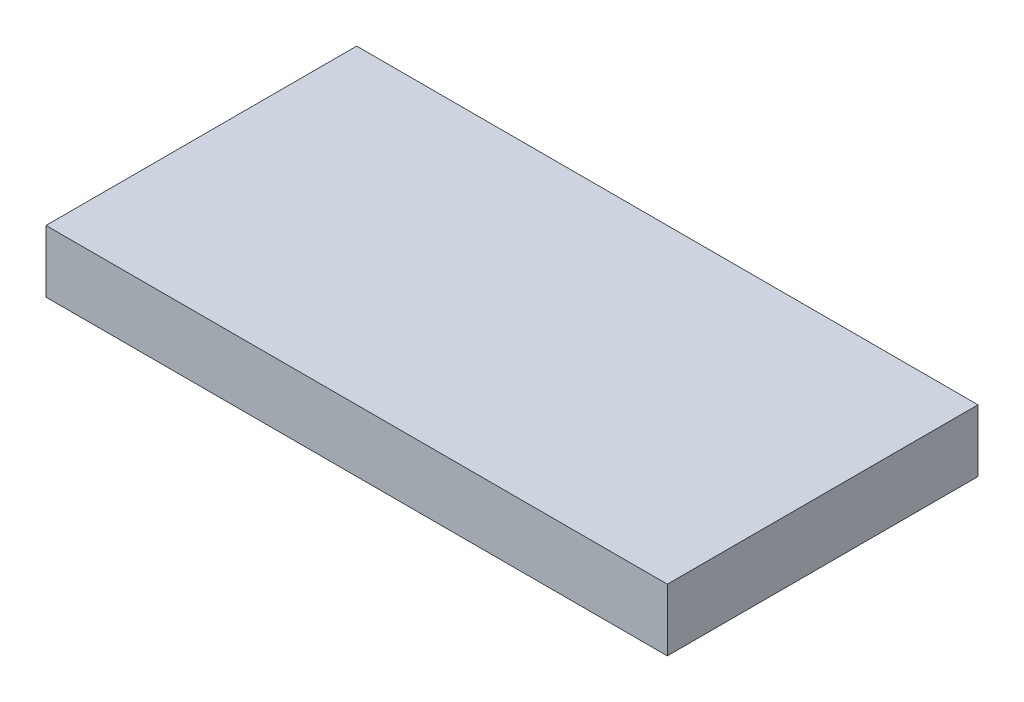
ISO-10303-21;
HEADER;
FILE_DESCRIPTION(('STEP AP214'),'2;1');
FILE_NAME('part.step','',(''),(''),'','','');
FILE_SCHEMA(('AUTOMOTIVE_DESIGN { 1 0 10303 214 1 1 1 1 }'));
ENDSEC;
DATA;
#1=APPLICATION_CONTEXT('core data for automotive mechanical design processes');
#2=APPLICATION_PROTOCOL_DEFINITION('international standard','automotive_design',2000,#1);
#3=PRODUCT_CONTEXT('',#1,'mechanical');
#4=PRODUCT('Part','Part','',(#3));
#5=PRODUCT_RELATED_PRODUCT_CATEGORY('part','',(#4));
#6=PRODUCT_DEFINITION_FORMATION('','',#4);
#7=PRODUCT_DEFINITION_CONTEXT('part definition',#1,'design');
#8=PRODUCT_DEFINITION('design','',#6,#7);
#9=PRODUCT_DEFINITION_SHAPE('','',#8);
#10=(LENGTH_UNIT() NAMED_UNIT(*) SI_UNIT(.MILLI.,.METRE.));
#11=(NAMED_UNIT(*) PLANE_ANGLE_UNIT() SI_UNIT($,.RADIAN.));
#12=(NAMED_UNIT(*) SI_UNIT($,.STERADIAN.) SOLID_ANGLE_UNIT());
#13=UNCERTAINTY_MEASURE_WITH_UNIT(LENGTH_MEASURE(1.E-05),#10,'distance_accuracy_value','');
#14=(GEOMETRIC_REPRESENTATION_CONTEXT(3) GLOBAL_UNCERTAINTY_ASSIGNED_CONTEXT((#13)) GLOBAL_UNIT_ASSIGNED_CONTEXT((#10,
#11,#12)) REPRESENTATION_CONTEXT('',''));
#15=CARTESIAN_POINT('',(0.,0.,0.));
#16=DIRECTION('',(0.,0.,1.));
#17=DIRECTION('',(1.,0.,0.));
#18=AXIS2_PLACEMENT_3D('',#15,#16,#17);
#19=CARTESIAN_POINT('',(0.,4.,0.));
#20=DIRECTION('',(1.,0.,0.));
#21=DIRECTION('',(0.,0.,-1.));
#22=AXIS2_PLACEMENT_3D('',#19,#20,#21);
#23=PLANE('',#22);
#24=DIRECTION('',(0.,0.,1.));
#25=VECTOR('',#24,1.);
#26=CARTESIAN_POINT('',(0.,0.,0.));
#27=LINE('',#26,#25);
#28=CARTESIAN_POINT('',(0.,0.,-20.));
#29=VERTEX_POINT('',#28);
#30=CARTESIAN_POINT('',(0.,0.,0.));
#31=VERTEX_POINT('',#30);
#32=EDGE_CURVE('E105',#29,#31,#27,.T.);
#33=ORIENTED_EDGE('',*,*,#32,.T.);
#34=DIRECTION('',(0.,-1.,0.));
#35=VECTOR('',#34,1.);
#36=CARTESIAN_POINT('',(0.,4.,0.));
#37=LINE('',#36,#35);
#38=CARTESIAN_POINT('',(0.,4.,0.));
#39=VERTEX_POINT('',#38);
#40=EDGE_CURVE('E11',#39,#31,#37,.T.);
#41=ORIENTED_EDGE('',*,*,#40,.F.);
#42=DIRECTION('',(0.,0.,1.));
#43=VECTOR('',#42,1.);
#44=CARTESIAN_POINT('',(0.,4.,0.));
#45=LINE('',#44,#43);
#46=CARTESIAN_POINT('',(0.,4.,-20.));
#47=VERTEX_POINT('',#46);
#48=EDGE_CURVE('E89',#47,#39,#45,.T.);
#49=ORIENTED_EDGE('',*,*,#48,.F.);
#50=DIRECTION('',(0.,-1.,0.));
#51=VECTOR('',#50,1.);
#52=CARTESIAN_POINT('',(0.,4.,-20.));
#53=LINE('',#52,#51);
#54=EDGE_CURVE('E97',#47,#29,#53,.T.);
#55=ORIENTED_EDGE('',*,*,#54,.T.);
#56=EDGE_LOOP('',(#33,#41,#49,#55));
#57=FACE_BOUND('',#56,.T.);
#58=ADVANCED_FACE('F39',(#57),#23,.F.);
#59=CARTESIAN_POINT('',(0.,4.,0.));
#60=DIRECTION('',(0.,0.,-1.));
#61=DIRECTION('',(-1.,0.,0.));
#62=AXIS2_PLACEMENT_3D('',#59,#60,#61);
#63=PLANE('',#62);
#64=DIRECTION('',(1.,0.,0.));
#65=VECTOR('',#64,1.);
#66=CARTESIAN_POINT('',(0.,0.,0.));
#67=LINE('',#66,#65);
#68=CARTESIAN_POINT('',(40.,0.,0.));
#69=VERTEX_POINT('',#68);
#70=EDGE_CURVE('E92',#31,#69,#67,.T.);
#71=ORIENTED_EDGE('',*,*,#70,.T.);
#72=DIRECTION('',(0.,-1.,0.));
#73=VECTOR('',#72,1.);
#74=CARTESIAN_POINT('',(40.,4.,0.));
#75=LINE('',#74,#73);
#76=CARTESIAN_POINT('',(40.,4.,0.));
#77=VERTEX_POINT('',#76);
#78=EDGE_CURVE('E50',#77,#69,#75,.T.);
#79=ORIENTED_EDGE('',*,*,#78,.F.);
#80=DIRECTION('',(1.,0.,0.));
#81=VECTOR('',#80,1.);
#82=CARTESIAN_POINT('',(0.,4.,0.));
#83=LINE('',#82,#81);
#84=EDGE_CURVE('E82',#39,#77,#83,.T.);
#85=ORIENTED_EDGE('',*,*,#84,.F.);
#86=ORIENTED_EDGE('',*,*,#40,.T.);
#87=EDGE_LOOP('',(#71,#79,#85,#86));
#88=FACE_BOUND('',#87,.T.);
#89=ADVANCED_FACE('F93',(#88),#63,.F.);
#90=CARTESIAN_POINT('',(40.,4.,0.));
#91=DIRECTION('',(-1.,0.,0.));
#92=DIRECTION('',(0.,0.,1.));
#93=AXIS2_PLACEMENT_3D('',#90,#91,#92);
#94=PLANE('',#93);
#95=DIRECTION('',(0.,0.,-1.));
#96=VECTOR('',#95,1.);
#97=CARTESIAN_POINT('',(40.,0.,0.));
#98=LINE('',#97,#96);
#99=CARTESIAN_POINT('',(40.,0.,-20.));
#100=VERTEX_POINT('',#99);
#101=EDGE_CURVE('E72',#69,#100,#98,.T.);
#102=ORIENTED_EDGE('',*,*,#101,.T.);
#103=DIRECTION('',(0.,-1.,0.));
#104=VECTOR('',#103,1.);
#105=CARTESIAN_POINT('',(40.,4.,-20.));
#106=LINE('',#105,#104);
#107=CARTESIAN_POINT('',(40.,4.,-20.));
#108=VERTEX_POINT('',#107);
#109=EDGE_CURVE('E94',#108,#100,#106,.T.);
#110=ORIENTED_EDGE('',*,*,#109,.F.);
#111=DIRECTION('',(0.,0.,-1.));
#112=VECTOR('',#111,1.);
#113=CARTESIAN_POINT('',(40.,4.,0.));
#114=LINE('',#113,#112);
#115=EDGE_CURVE('E88',#77,#108,#114,.T.);
#116=ORIENTED_EDGE('',*,*,#115,.F.);
#117=ORIENTED_EDGE('',*,*,#78,.T.);
#118=EDGE_LOOP('',(#102,#110,#116,#117));
#119=FACE_BOUND('',#118,.T.);
#120=ADVANCED_FACE('F96',(#119),#94,.F.);
#121=CARTESIAN_POINT('',(0.,4.,-20.));
#122=DIRECTION('',(0.,0.,1.));
#123=DIRECTION('',(1.,0.,0.));
#124=AXIS2_PLACEMENT_3D('',#121,#122,#123);
#125=PLANE('',#124);
#126=DIRECTION('',(-1.,0.,0.));
#127=VECTOR('',#126,1.);
#128=CARTESIAN_POINT('',(0.,0.,-20.));
#129=LINE('',#128,#127);
#130=EDGE_CURVE('E76',#100,#29,#129,.T.);
#131=ORIENTED_EDGE('',*,*,#130,.T.);
#132=ORIENTED_EDGE('',*,*,#54,.F.);
#133=DIRECTION('',(-1.,0.,0.));
#134=VECTOR('',#133,1.);
#135=CARTESIAN_POINT('',(0.,4.,-20.));
#136=LINE('',#135,#134);
#137=EDGE_CURVE('E54',#108,#47,#136,.T.);
#138=ORIENTED_EDGE('',*,*,#137,.F.);
#139=ORIENTED_EDGE('',*,*,#109,.T.);
#140=EDGE_LOOP('',(#131,#132,#138,#139));
#141=FACE_BOUND('',#140,.T.);
#142=ADVANCED_FACE('F108',(#141),#125,.F.);
#143=CARTESIAN_POINT('',(0.,4.,0.));
#144=DIRECTION('',(0.,-1.,0.));
#145=DIRECTION('',(0.,0.,-1.));
#146=AXIS2_PLACEMENT_3D('',#143,#144,#145);
#147=PLANE('',#146);
#148=ORIENTED_EDGE('',*,*,#48,.T.);
#149=ORIENTED_EDGE('',*,*,#84,.T.);
#150=ORIENTED_EDGE('',*,*,#115,.T.);
#151=ORIENTED_EDGE('',*,*,#137,.T.);
#152=EDGE_LOOP('',(#148,#149,#150,#151));
#153=FACE_BOUND('',#152,.T.);
#154=ADVANCED_FACE('F86',(#153),#147,.F.);
#155=CARTESIAN_POINT('',(0.,0.,0.));
#156=DIRECTION('',(0.,-1.,0.));
#157=DIRECTION('',(0.,0.,-1.));
#158=AXIS2_PLACEMENT_3D('',#155,#156,#157);
#159=PLANE('',#158);
#160=ORIENTED_EDGE('',*,*,#32,.F.);
#161=ORIENTED_EDGE('',*,*,#130,.F.);
#162=ORIENTED_EDGE('',*,*,#101,.F.);
#163=ORIENTED_EDGE('',*,*,#70,.F.);
#164=EDGE_LOOP('',(#160,#161,#162,#163));
#165=FACE_BOUND('',#164,.T.);
#166=ADVANCED_FACE('F115',(#165),#159,.T.);
#167=CLOSED_SHELL('',(#58,#89,#120,#142,#154,#166));
#168=MANIFOLD_SOLID_BREP('B2',#167);
#169=ADVANCED_BREP_SHAPE_REPRESENTATION('',(#18,#168),#14);
#170=SHAPE_DEFINITION_REPRESENTATION(#9,#169);
ENDSEC;
END-ISO-10303-21;
